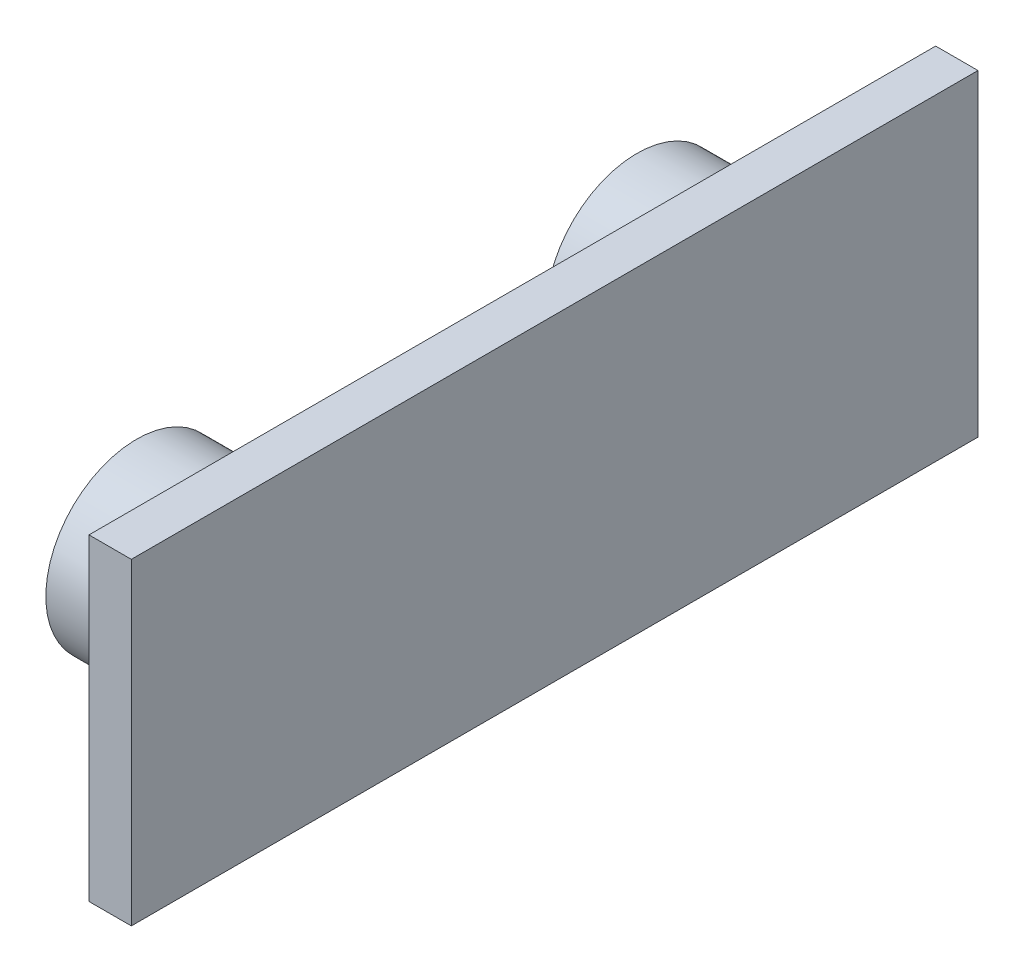
ISO-10303-21;
HEADER;
FILE_DESCRIPTION(('STEP AP214'),'2;1');
FILE_NAME('part.step','',(''),(''),'','','');
FILE_SCHEMA(('AUTOMOTIVE_DESIGN { 1 0 10303 214 1 1 1 1 }'));
ENDSEC;
DATA;
#1=APPLICATION_CONTEXT('core data for automotive mechanical design processes');
#2=APPLICATION_PROTOCOL_DEFINITION('international standard','automotive_design',2000,#1);
#3=PRODUCT_CONTEXT('',#1,'mechanical');
#4=PRODUCT('Part','Part','',(#3));
#5=PRODUCT_RELATED_PRODUCT_CATEGORY('part','',(#4));
#6=PRODUCT_DEFINITION_FORMATION('','',#4);
#7=PRODUCT_DEFINITION_CONTEXT('part definition',#1,'design');
#8=PRODUCT_DEFINITION('design','',#6,#7);
#9=PRODUCT_DEFINITION_SHAPE('','',#8);
#10=(LENGTH_UNIT() NAMED_UNIT(*) SI_UNIT(.MILLI.,.METRE.));
#11=(NAMED_UNIT(*) PLANE_ANGLE_UNIT() SI_UNIT($,.RADIAN.));
#12=(NAMED_UNIT(*) SI_UNIT($,.STERADIAN.) SOLID_ANGLE_UNIT());
#13=UNCERTAINTY_MEASURE_WITH_UNIT(LENGTH_MEASURE(1.E-05),#10,'distance_accuracy_value','');
#14=(GEOMETRIC_REPRESENTATION_CONTEXT(3) GLOBAL_UNCERTAINTY_ASSIGNED_CONTEXT((#13)) GLOBAL_UNIT_ASSIGNED_CONTEXT((#10,
#11,#12)) REPRESENTATION_CONTEXT('',''));
#15=CARTESIAN_POINT('',(0.,0.,0.));
#16=DIRECTION('',(0.,0.,1.));
#17=DIRECTION('',(1.,0.,0.));
#18=AXIS2_PLACEMENT_3D('',#15,#16,#17);
#19=CARTESIAN_POINT('',(2.,0.,0.));
#20=DIRECTION('',(1.,0.,0.));
#21=DIRECTION('',(0.,0.,-1.));
#22=AXIS2_PLACEMENT_3D('',#19,#20,#21);
#23=PLANE('',#22);
#24=DIRECTION('',(0.,-1.,0.));
#25=VECTOR('',#24,1.);
#26=CARTESIAN_POINT('',(2.,-7.5,20.));
#27=LINE('',#26,#25);
#28=CARTESIAN_POINT('',(2.,7.5,20.));
#29=VERTEX_POINT('',#28);
#30=CARTESIAN_POINT('',(2.,-7.5,20.));
#31=VERTEX_POINT('',#30);
#32=EDGE_CURVE('E84',#29,#31,#27,.T.);
#33=ORIENTED_EDGE('',*,*,#32,.T.);
#34=DIRECTION('',(0.,0.,-1.));
#35=VECTOR('',#34,1.);
#36=CARTESIAN_POINT('',(2.,-7.5,-20.));
#37=LINE('',#36,#35);
#38=CARTESIAN_POINT('',(2.,-7.5,-20.));
#39=VERTEX_POINT('',#38);
#40=EDGE_CURVE('E80',#31,#39,#37,.T.);
#41=ORIENTED_EDGE('',*,*,#40,.T.);
#42=DIRECTION('',(0.,1.,0.));
#43=VECTOR('',#42,1.);
#44=CARTESIAN_POINT('',(2.,-7.5,-20.));
#45=LINE('',#44,#43);
#46=CARTESIAN_POINT('',(2.,7.5,-20.));
#47=VERTEX_POINT('',#46);
#48=EDGE_CURVE('E82',#39,#47,#45,.T.);
#49=ORIENTED_EDGE('',*,*,#48,.T.);
#50=DIRECTION('',(0.,0.,1.));
#51=VECTOR('',#50,1.);
#52=CARTESIAN_POINT('',(2.,7.5,-20.));
#53=LINE('',#52,#51);
#54=EDGE_CURVE('E50',#47,#29,#53,.T.);
#55=ORIENTED_EDGE('',*,*,#54,.T.);
#56=EDGE_LOOP('',(#33,#41,#49,#55));
#57=FACE_BOUND('',#56,.T.);
#58=ADVANCED_FACE('F33',(#57),#23,.T.);
#59=CARTESIAN_POINT('',(0.,0.,0.));
#60=DIRECTION('',(1.,0.,0.));
#61=DIRECTION('',(0.,0.,-1.));
#62=AXIS2_PLACEMENT_3D('',#59,#60,#61);
#63=PLANE('',#62);
#64=DIRECTION('',(0.,-1.,0.));
#65=VECTOR('',#64,1.);
#66=CARTESIAN_POINT('',(0.,-7.5,20.));
#67=LINE('',#66,#65);
#68=CARTESIAN_POINT('',(0.,7.5,20.));
#69=VERTEX_POINT('',#68);
#70=CARTESIAN_POINT('',(0.,-7.5,20.));
#71=VERTEX_POINT('',#70);
#72=EDGE_CURVE('E96',#69,#71,#67,.T.);
#73=ORIENTED_EDGE('',*,*,#72,.F.);
#74=DIRECTION('',(0.,0.,1.));
#75=VECTOR('',#74,1.);
#76=CARTESIAN_POINT('',(0.,7.5,-20.));
#77=LINE('',#76,#75);
#78=CARTESIAN_POINT('',(0.,7.5,-20.));
#79=VERTEX_POINT('',#78);
#80=EDGE_CURVE('E73',#79,#69,#77,.T.);
#81=ORIENTED_EDGE('',*,*,#80,.F.);
#82=DIRECTION('',(0.,1.,0.));
#83=VECTOR('',#82,1.);
#84=CARTESIAN_POINT('',(0.,-7.5,-20.));
#85=LINE('',#84,#83);
#86=CARTESIAN_POINT('',(0.,-7.5,-20.));
#87=VERTEX_POINT('',#86);
#88=EDGE_CURVE('E67',#87,#79,#85,.T.);
#89=ORIENTED_EDGE('',*,*,#88,.F.);
#90=DIRECTION('',(0.,0.,-1.));
#91=VECTOR('',#90,1.);
#92=CARTESIAN_POINT('',(0.,-7.5,-20.));
#93=LINE('',#92,#91);
#94=EDGE_CURVE('E88',#71,#87,#93,.T.);
#95=ORIENTED_EDGE('',*,*,#94,.F.);
#96=EDGE_LOOP('',(#73,#81,#89,#95));
#97=FACE_BOUND('',#96,.T.);
#98=CARTESIAN_POINT('',(0.,0.,11.747572815534));
#99=DIRECTION('',(1.,0.,0.));
#100=DIRECTION('',(0.,0.,-1.));
#101=AXIS2_PLACEMENT_3D('',#98,#99,#100);
#102=CIRCLE('',#101,4.29165749617482);
#103=CARTESIAN_POINT('',(0.,0.,7.45591531935916));
#104=VERTEX_POINT('',#103);
#105=EDGE_CURVE('E99',#104,#104,#102,.T.);
#106=ORIENTED_EDGE('',*,*,#105,.T.);
#107=EDGE_LOOP('',(#106));
#108=FACE_BOUND('',#107,.T.);
#109=CARTESIAN_POINT('',(0.,-0.124269275442575,-11.8912611724657));
#110=DIRECTION('',(1.,0.,0.));
#111=DIRECTION('',(0.,0.,-1.));
#112=AXIS2_PLACEMENT_3D('',#109,#110,#111);
#113=CIRCLE('',#112,4.29165749617483);
#114=CARTESIAN_POINT('',(0.,-0.124269275442575,-16.1829186686405));
#115=VERTEX_POINT('',#114);
#116=EDGE_CURVE('E116',#115,#115,#113,.T.);
#117=ORIENTED_EDGE('',*,*,#116,.T.);
#118=EDGE_LOOP('',(#117));
#119=FACE_BOUND('',#118,.T.);
#120=ADVANCED_FACE('F107',(#97,#108,#119),#63,.F.);
#121=CARTESIAN_POINT('',(2.,-7.5,20.));
#122=DIRECTION('',(0.,0.,-1.));
#123=DIRECTION('',(-1.,0.,0.));
#124=AXIS2_PLACEMENT_3D('',#121,#122,#123);
#125=PLANE('',#124);
#126=ORIENTED_EDGE('',*,*,#72,.T.);
#127=DIRECTION('',(-1.,0.,0.));
#128=VECTOR('',#127,1.);
#129=CARTESIAN_POINT('',(2.,-7.5,20.));
#130=LINE('',#129,#128);
#131=EDGE_CURVE('E11',#31,#71,#130,.T.);
#132=ORIENTED_EDGE('',*,*,#131,.F.);
#133=ORIENTED_EDGE('',*,*,#32,.F.);
#134=DIRECTION('',(-1.,0.,0.));
#135=VECTOR('',#134,1.);
#136=CARTESIAN_POINT('',(2.,7.5,20.));
#137=LINE('',#136,#135);
#138=EDGE_CURVE('E92',#29,#69,#137,.T.);
#139=ORIENTED_EDGE('',*,*,#138,.T.);
#140=EDGE_LOOP('',(#126,#132,#133,#139));
#141=FACE_BOUND('',#140,.T.);
#142=ADVANCED_FACE('F35',(#141),#125,.F.);
#143=CARTESIAN_POINT('',(2.,-7.5,-20.));
#144=DIRECTION('',(0.,1.,0.));
#145=DIRECTION('',(0.,0.,1.));
#146=AXIS2_PLACEMENT_3D('',#143,#144,#145);
#147=PLANE('',#146);
#148=ORIENTED_EDGE('',*,*,#94,.T.);
#149=DIRECTION('',(-1.,0.,0.));
#150=VECTOR('',#149,1.);
#151=CARTESIAN_POINT('',(2.,-7.5,-20.));
#152=LINE('',#151,#150);
#153=EDGE_CURVE('E42',#39,#87,#152,.T.);
#154=ORIENTED_EDGE('',*,*,#153,.F.);
#155=ORIENTED_EDGE('',*,*,#40,.F.);
#156=ORIENTED_EDGE('',*,*,#131,.T.);
#157=EDGE_LOOP('',(#148,#154,#155,#156));
#158=FACE_BOUND('',#157,.T.);
#159=ADVANCED_FACE('F87',(#158),#147,.F.);
#160=CARTESIAN_POINT('',(2.,-7.5,-20.));
#161=DIRECTION('',(0.,0.,1.));
#162=DIRECTION('',(1.,0.,0.));
#163=AXIS2_PLACEMENT_3D('',#160,#161,#162);
#164=PLANE('',#163);
#165=ORIENTED_EDGE('',*,*,#88,.T.);
#166=DIRECTION('',(-1.,0.,0.));
#167=VECTOR('',#166,1.);
#168=CARTESIAN_POINT('',(2.,7.5,-20.));
#169=LINE('',#168,#167);
#170=EDGE_CURVE('E89',#47,#79,#169,.T.);
#171=ORIENTED_EDGE('',*,*,#170,.F.);
#172=ORIENTED_EDGE('',*,*,#48,.F.);
#173=ORIENTED_EDGE('',*,*,#153,.T.);
#174=EDGE_LOOP('',(#165,#171,#172,#173));
#175=FACE_BOUND('',#174,.T.);
#176=ADVANCED_FACE('F90',(#175),#164,.F.);
#177=CARTESIAN_POINT('',(2.,7.5,-20.));
#178=DIRECTION('',(0.,-1.,0.));
#179=DIRECTION('',(0.,0.,-1.));
#180=AXIS2_PLACEMENT_3D('',#177,#178,#179);
#181=PLANE('',#180);
#182=ORIENTED_EDGE('',*,*,#80,.T.);
#183=ORIENTED_EDGE('',*,*,#138,.F.);
#184=ORIENTED_EDGE('',*,*,#54,.F.);
#185=ORIENTED_EDGE('',*,*,#170,.T.);
#186=EDGE_LOOP('',(#182,#183,#184,#185));
#187=FACE_BOUND('',#186,.T.);
#188=ADVANCED_FACE('F104',(#187),#181,.F.);
#189=CARTESIAN_POINT('',(-6.,0.,11.747572815534));
#190=DIRECTION('',(1.,0.,0.));
#191=DIRECTION('',(0.,0.,-1.));
#192=AXIS2_PLACEMENT_3D('',#189,#190,#191);
#193=CYLINDRICAL_SURFACE('',#192,4.29165749617482);
#194=CARTESIAN_POINT('',(-6.,0.,11.747572815534));
#195=DIRECTION('',(1.,0.,0.));
#196=DIRECTION('',(0.,0.,-1.));
#197=AXIS2_PLACEMENT_3D('',#194,#195,#196);
#198=CIRCLE('',#197,4.29165749617482);
#199=CARTESIAN_POINT('',(-6.,0.,7.45591531935916));
#200=VERTEX_POINT('',#199);
#201=EDGE_CURVE('E113',#200,#200,#198,.T.);
#202=ORIENTED_EDGE('',*,*,#201,.T.);
#203=EDGE_LOOP('',(#202));
#204=FACE_BOUND('',#203,.T.);
#205=ORIENTED_EDGE('',*,*,#105,.F.);
#206=EDGE_LOOP('',(#205));
#207=FACE_BOUND('',#206,.T.);
#208=ADVANCED_FACE('F143',(#204,#207),#193,.T.);
#209=CARTESIAN_POINT('',(-6.,0.,11.747572815534));
#210=DIRECTION('',(1.,0.,0.));
#211=DIRECTION('',(0.,0.,-1.));
#212=AXIS2_PLACEMENT_3D('',#209,#210,#211);
#213=PLANE('',#212);
#214=ORIENTED_EDGE('',*,*,#201,.F.);
#215=EDGE_LOOP('',(#214));
#216=FACE_BOUND('',#215,.T.);
#217=ADVANCED_FACE('F132',(#216),#213,.F.);
#218=CARTESIAN_POINT('',(-6.,-0.124269275442575,-11.8912611724657));
#219=DIRECTION('',(1.,0.,0.));
#220=DIRECTION('',(0.,0.,-1.));
#221=AXIS2_PLACEMENT_3D('',#218,#219,#220);
#222=CYLINDRICAL_SURFACE('',#221,4.29165749617483);
#223=CARTESIAN_POINT('',(-6.,-0.124269275442575,-11.8912611724657));
#224=DIRECTION('',(1.,0.,0.));
#225=DIRECTION('',(0.,0.,-1.));
#226=AXIS2_PLACEMENT_3D('',#223,#224,#225);
#227=CIRCLE('',#226,4.29165749617483);
#228=CARTESIAN_POINT('',(-6.,-0.124269275442575,-16.1829186686405));
#229=VERTEX_POINT('',#228);
#230=EDGE_CURVE('E119',#229,#229,#227,.T.);
#231=ORIENTED_EDGE('',*,*,#230,.T.);
#232=EDGE_LOOP('',(#231));
#233=FACE_BOUND('',#232,.T.);
#234=ORIENTED_EDGE('',*,*,#116,.F.);
#235=EDGE_LOOP('',(#234));
#236=FACE_BOUND('',#235,.T.);
#237=ADVANCED_FACE('F123',(#233,#236),#222,.T.);
#238=CARTESIAN_POINT('',(-6.,-0.124269275442575,-11.8912611724657));
#239=DIRECTION('',(1.,0.,0.));
#240=DIRECTION('',(0.,0.,-1.));
#241=AXIS2_PLACEMENT_3D('',#238,#239,#240);
#242=PLANE('',#241);
#243=ORIENTED_EDGE('',*,*,#230,.F.);
#244=EDGE_LOOP('',(#243));
#245=FACE_BOUND('',#244,.T.);
#246=ADVANCED_FACE('F126',(#245),#242,.F.);
#247=CLOSED_SHELL('',(#58,#120,#142,#159,#176,#188,#208,#217,#237,#246));
#248=MANIFOLD_SOLID_BREP('B2',#247);
#249=ADVANCED_BREP_SHAPE_REPRESENTATION('',(#18,#248),#14);
#250=SHAPE_DEFINITION_REPRESENTATION(#9,#249);
ENDSEC;
END-ISO-10303-21;
